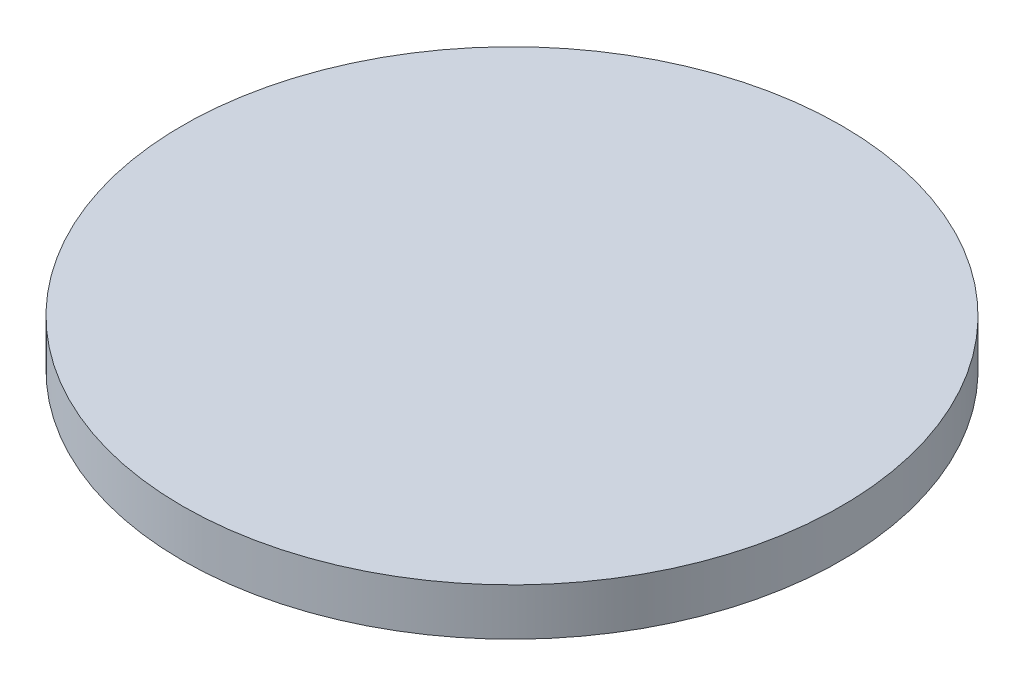
ISO-10303-21;
HEADER;
FILE_DESCRIPTION(('STEP AP214'),'2;1');
FILE_NAME('part.step','',(''),(''),'','','');
FILE_SCHEMA(('AUTOMOTIVE_DESIGN { 1 0 10303 214 1 1 1 1 }'));
ENDSEC;
DATA;
#1=APPLICATION_CONTEXT('core data for automotive mechanical design processes');
#2=APPLICATION_PROTOCOL_DEFINITION('international standard','automotive_design',2000,#1);
#3=PRODUCT_CONTEXT('',#1,'mechanical');
#4=PRODUCT('Part','Part','',(#3));
#5=PRODUCT_RELATED_PRODUCT_CATEGORY('part','',(#4));
#6=PRODUCT_DEFINITION_FORMATION('','',#4);
#7=PRODUCT_DEFINITION_CONTEXT('part definition',#1,'design');
#8=PRODUCT_DEFINITION('design','',#6,#7);
#9=PRODUCT_DEFINITION_SHAPE('','',#8);
#10=(LENGTH_UNIT() NAMED_UNIT(*) SI_UNIT(.MILLI.,.METRE.));
#11=(NAMED_UNIT(*) PLANE_ANGLE_UNIT() SI_UNIT($,.RADIAN.));
#12=(NAMED_UNIT(*) SI_UNIT($,.STERADIAN.) SOLID_ANGLE_UNIT());
#13=UNCERTAINTY_MEASURE_WITH_UNIT(LENGTH_MEASURE(1.E-05),#10,'distance_accuracy_value','');
#14=(GEOMETRIC_REPRESENTATION_CONTEXT(3) GLOBAL_UNCERTAINTY_ASSIGNED_CONTEXT((#13)) GLOBAL_UNIT_ASSIGNED_CONTEXT((#10,
#11,#12)) REPRESENTATION_CONTEXT('',''));
#15=CARTESIAN_POINT('',(0.,0.,0.));
#16=DIRECTION('',(0.,0.,1.));
#17=DIRECTION('',(1.,0.,0.));
#18=AXIS2_PLACEMENT_3D('',#15,#16,#17);
#19=CARTESIAN_POINT('',(0.,20.,0.));
#20=DIRECTION('',(0.,-1.,0.));
#21=DIRECTION('',(0.,0.,-1.));
#22=AXIS2_PLACEMENT_3D('',#19,#20,#21);
#23=CYLINDRICAL_SURFACE('',#22,140.);
#24=CARTESIAN_POINT('',(0.,20.,0.));
#25=DIRECTION('',(0.,1.,0.));
#26=DIRECTION('',(0.,0.,1.));
#27=AXIS2_PLACEMENT_3D('',#24,#25,#26);
#28=CIRCLE('',#27,140.);
#29=CARTESIAN_POINT('',(0.,20.,140.));
#30=VERTEX_POINT('',#29);
#31=EDGE_CURVE('E10',#30,#30,#28,.T.);
#32=ORIENTED_EDGE('',*,*,#31,.F.);
#33=EDGE_LOOP('',(#32));
#34=FACE_BOUND('',#33,.T.);
#35=CARTESIAN_POINT('',(0.,0.,0.));
#36=DIRECTION('',(0.,1.,0.));
#37=DIRECTION('',(0.,0.,1.));
#38=AXIS2_PLACEMENT_3D('',#35,#36,#37);
#39=CIRCLE('',#38,140.);
#40=CARTESIAN_POINT('',(0.,0.,140.));
#41=VERTEX_POINT('',#40);
#42=EDGE_CURVE('E38',#41,#41,#39,.T.);
#43=ORIENTED_EDGE('',*,*,#42,.T.);
#44=EDGE_LOOP('',(#43));
#45=FACE_BOUND('',#44,.T.);
#46=ADVANCED_FACE('F35',(#34,#45),#23,.T.);
#47=CARTESIAN_POINT('',(0.,20.,0.));
#48=DIRECTION('',(0.,1.,0.));
#49=DIRECTION('',(0.,0.,1.));
#50=AXIS2_PLACEMENT_3D('',#47,#48,#49);
#51=PLANE('',#50);
#52=ORIENTED_EDGE('',*,*,#31,.T.);
#53=EDGE_LOOP('',(#52));
#54=FACE_BOUND('',#53,.T.);
#55=ADVANCED_FACE('F50',(#54),#51,.T.);
#56=CARTESIAN_POINT('',(0.,0.,0.));
#57=DIRECTION('',(0.,1.,0.));
#58=DIRECTION('',(0.,0.,1.));
#59=AXIS2_PLACEMENT_3D('',#56,#57,#58);
#60=PLANE('',#59);
#61=ORIENTED_EDGE('',*,*,#42,.F.);
#62=EDGE_LOOP('',(#61));
#63=FACE_BOUND('',#62,.T.);
#64=ADVANCED_FACE('F48',(#63),#60,.F.);
#65=CLOSED_SHELL('',(#46,#55,#64));
#66=MANIFOLD_SOLID_BREP('B2',#65);
#67=ADVANCED_BREP_SHAPE_REPRESENTATION('',(#18,#66),#14);
#68=SHAPE_DEFINITION_REPRESENTATION(#9,#67);
ENDSEC;
END-ISO-10303-21;
